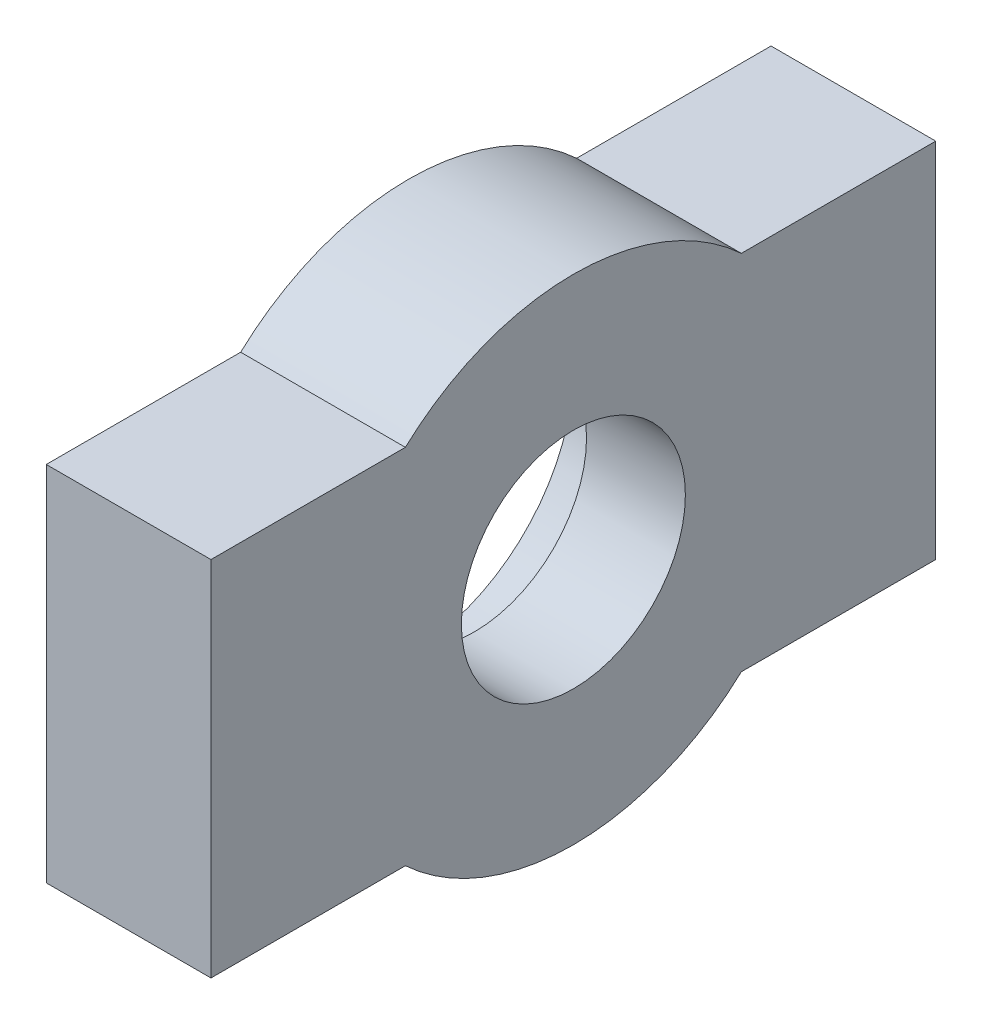
ISO-10303-21;
HEADER;
FILE_DESCRIPTION(('STEP AP214'),'2;1');
FILE_NAME('part.step','',(''),(''),'','','');
FILE_SCHEMA(('AUTOMOTIVE_DESIGN { 1 0 10303 214 1 1 1 1 }'));
ENDSEC;
DATA;
#1=APPLICATION_CONTEXT('core data for automotive mechanical design processes');
#2=APPLICATION_PROTOCOL_DEFINITION('international standard','automotive_design',2000,#1);
#3=PRODUCT_CONTEXT('',#1,'mechanical');
#4=PRODUCT('Part','Part','',(#3));
#5=PRODUCT_RELATED_PRODUCT_CATEGORY('part','',(#4));
#6=PRODUCT_DEFINITION_FORMATION('','',#4);
#7=PRODUCT_DEFINITION_CONTEXT('part definition',#1,'design');
#8=PRODUCT_DEFINITION('design','',#6,#7);
#9=PRODUCT_DEFINITION_SHAPE('','',#8);
#10=(LENGTH_UNIT() NAMED_UNIT(*) SI_UNIT(.MILLI.,.METRE.));
#11=(NAMED_UNIT(*) PLANE_ANGLE_UNIT() SI_UNIT($,.RADIAN.));
#12=(NAMED_UNIT(*) SI_UNIT($,.STERADIAN.) SOLID_ANGLE_UNIT());
#13=UNCERTAINTY_MEASURE_WITH_UNIT(LENGTH_MEASURE(1.E-05),#10,'distance_accuracy_value','');
#14=(GEOMETRIC_REPRESENTATION_CONTEXT(3) GLOBAL_UNCERTAINTY_ASSIGNED_CONTEXT((#13)) GLOBAL_UNIT_ASSIGNED_CONTEXT((#10,
#11,#12)) REPRESENTATION_CONTEXT('',''));
#15=CARTESIAN_POINT('',(0.,0.,0.));
#16=DIRECTION('',(0.,0.,1.));
#17=DIRECTION('',(1.,0.,0.));
#18=AXIS2_PLACEMENT_3D('',#15,#16,#17);
#19=CARTESIAN_POINT('',(5.,0.,0.));
#20=DIRECTION('',(-1.,0.,0.));
#21=DIRECTION('',(0.,0.,1.));
#22=AXIS2_PLACEMENT_3D('',#19,#20,#21);
#23=CYLINDRICAL_SURFACE('',#22,7.5);
#24=CARTESIAN_POINT('',(5.,0.,0.));
#25=DIRECTION('',(1.,0.,0.));
#26=DIRECTION('',(0.,0.,-1.));
#27=AXIS2_PLACEMENT_3D('',#24,#25,#26);
#28=CIRCLE('',#27,7.5);
#29=CARTESIAN_POINT('',(5.,5.5,-5.09901951359279));
#30=VERTEX_POINT('',#29);
#31=CARTESIAN_POINT('',(5.,5.5,5.09901951359279));
#32=VERTEX_POINT('',#31);
#33=EDGE_CURVE('E44',#30,#32,#28,.T.);
#34=ORIENTED_EDGE('',*,*,#33,.F.);
#35=DIRECTION('',(-1.,0.,0.));
#36=VECTOR('',#35,1.);
#37=CARTESIAN_POINT('',(5.,5.5,-5.09901951359279));
#38=LINE('',#37,#36);
#39=CARTESIAN_POINT('',(0.,5.5,-5.09901951359279));
#40=VERTEX_POINT('',#39);
#41=EDGE_CURVE('E134',#30,#40,#38,.T.);
#42=ORIENTED_EDGE('',*,*,#41,.T.);
#43=CARTESIAN_POINT('',(0.,0.,0.));
#44=DIRECTION('',(1.,0.,0.));
#45=DIRECTION('',(0.,0.,-1.));
#46=AXIS2_PLACEMENT_3D('',#43,#44,#45);
#47=CIRCLE('',#46,7.5);
#48=CARTESIAN_POINT('',(0.,5.5,5.09901951359279));
#49=VERTEX_POINT('',#48);
#50=EDGE_CURVE('E172',#40,#49,#47,.T.);
#51=ORIENTED_EDGE('',*,*,#50,.T.);
#52=DIRECTION('',(-1.,0.,0.));
#53=VECTOR('',#52,1.);
#54=CARTESIAN_POINT('',(5.,5.5,5.09901951359279));
#55=LINE('',#54,#53);
#56=EDGE_CURVE('E160',#49,#32,#55,.F.);
#57=ORIENTED_EDGE('',*,*,#56,.T.);
#58=EDGE_LOOP('',(#34,#42,#51,#57));
#59=FACE_BOUND('',#58,.T.);
#60=ADVANCED_FACE('F35',(#59),#23,.T.);
#61=CARTESIAN_POINT('',(0.,-5.5,5.09901951359279));
#62=VERTEX_POINT('',#61);
#63=CARTESIAN_POINT('',(0.,-5.5,-5.09901951359279));
#64=VERTEX_POINT('',#63);
#65=EDGE_CURVE('E39',#62,#64,#47,.T.);
#66=ORIENTED_EDGE('',*,*,#65,.T.);
#67=DIRECTION('',(-1.,0.,0.));
#68=VECTOR('',#67,1.);
#69=CARTESIAN_POINT('',(5.,-5.5,-5.09901951359279));
#70=LINE('',#69,#68);
#71=CARTESIAN_POINT('',(5.,-5.5,-5.09901951359279));
#72=VERTEX_POINT('',#71);
#73=EDGE_CURVE('E58',#64,#72,#70,.F.);
#74=ORIENTED_EDGE('',*,*,#73,.T.);
#75=CARTESIAN_POINT('',(5.,-5.5,5.09901951359279));
#76=VERTEX_POINT('',#75);
#77=EDGE_CURVE('E11',#76,#72,#28,.T.);
#78=ORIENTED_EDGE('',*,*,#77,.F.);
#79=DIRECTION('',(-1.,0.,0.));
#80=VECTOR('',#79,1.);
#81=CARTESIAN_POINT('',(5.,-5.5,5.09901951359279));
#82=LINE('',#81,#80);
#83=EDGE_CURVE('E155',#76,#62,#82,.T.);
#84=ORIENTED_EDGE('',*,*,#83,.T.);
#85=EDGE_LOOP('',(#66,#74,#78,#84));
#86=FACE_BOUND('',#85,.T.);
#87=ADVANCED_FACE('F37',(#86),#23,.T.);
#88=CARTESIAN_POINT('',(5.,0.,0.));
#89=DIRECTION('',(1.,0.,0.));
#90=DIRECTION('',(0.,0.,-1.));
#91=AXIS2_PLACEMENT_3D('',#88,#89,#90);
#92=PLANE('',#91);
#93=ORIENTED_EDGE('',*,*,#77,.T.);
#94=DIRECTION('',(0.,0.,1.));
#95=VECTOR('',#94,1.);
#96=CARTESIAN_POINT('',(5.,-5.5,-11.));
#97=LINE('',#96,#95);
#98=CARTESIAN_POINT('',(5.,-5.5,-11.));
#99=VERTEX_POINT('',#98);
#100=EDGE_CURVE('E103',#99,#72,#97,.T.);
#101=ORIENTED_EDGE('',*,*,#100,.F.);
#102=DIRECTION('',(0.,-1.,0.));
#103=VECTOR('',#102,1.);
#104=CARTESIAN_POINT('',(5.,5.5,-11.));
#105=LINE('',#104,#103);
#106=CARTESIAN_POINT('',(5.,5.5,-11.));
#107=VERTEX_POINT('',#106);
#108=EDGE_CURVE('E118',#107,#99,#105,.T.);
#109=ORIENTED_EDGE('',*,*,#108,.F.);
#110=DIRECTION('',(0.,0.,-1.));
#111=VECTOR('',#110,1.);
#112=CARTESIAN_POINT('',(5.,5.5,-11.));
#113=LINE('',#112,#111);
#114=EDGE_CURVE('E111',#30,#107,#113,.T.);
#115=ORIENTED_EDGE('',*,*,#114,.F.);
#116=ORIENTED_EDGE('',*,*,#33,.T.);
#117=DIRECTION('',(0.,0.,-1.));
#118=VECTOR('',#117,1.);
#119=CARTESIAN_POINT('',(5.,5.5,5.));
#120=LINE('',#119,#118);
#121=CARTESIAN_POINT('',(5.,5.5,11.));
#122=VERTEX_POINT('',#121);
#123=EDGE_CURVE('E143',#122,#32,#120,.T.);
#124=ORIENTED_EDGE('',*,*,#123,.F.);
#125=DIRECTION('',(0.,1.,0.));
#126=VECTOR('',#125,1.);
#127=CARTESIAN_POINT('',(5.,5.5,11.));
#128=LINE('',#127,#126);
#129=CARTESIAN_POINT('',(5.,-5.5,11.));
#130=VERTEX_POINT('',#129);
#131=EDGE_CURVE('E139',#130,#122,#128,.T.);
#132=ORIENTED_EDGE('',*,*,#131,.F.);
#133=DIRECTION('',(0.,0.,1.));
#134=VECTOR('',#133,1.);
#135=CARTESIAN_POINT('',(5.,-5.5,5.));
#136=LINE('',#135,#134);
#137=EDGE_CURVE('E137',#76,#130,#136,.T.);
#138=ORIENTED_EDGE('',*,*,#137,.F.);
#139=EDGE_LOOP('',(#93,#101,#109,#115,#116,#124,#132,#138));
#140=FACE_BOUND('',#139,.T.);
#141=CARTESIAN_POINT('',(5.,0.,0.));
#142=DIRECTION('',(-1.,0.,0.));
#143=DIRECTION('',(0.,0.,1.));
#144=AXIS2_PLACEMENT_3D('',#141,#142,#143);
#145=CIRCLE('',#144,3.4);
#146=CARTESIAN_POINT('',(5.,0.,3.4));
#147=VERTEX_POINT('',#146);
#148=EDGE_CURVE('E163',#147,#147,#145,.T.);
#149=ORIENTED_EDGE('',*,*,#148,.T.);
#150=EDGE_LOOP('',(#149));
#151=FACE_BOUND('',#150,.T.);
#152=ADVANCED_FACE('F115',(#140,#151),#92,.T.);
#153=CARTESIAN_POINT('',(0.,0.,0.));
#154=DIRECTION('',(1.,0.,0.));
#155=DIRECTION('',(0.,0.,-1.));
#156=AXIS2_PLACEMENT_3D('',#153,#154,#155);
#157=PLANE('',#156);
#158=CARTESIAN_POINT('',(0.,0.,0.));
#159=DIRECTION('',(-1.,0.,0.));
#160=DIRECTION('',(0.,0.,1.));
#161=AXIS2_PLACEMENT_3D('',#158,#159,#160);
#162=CIRCLE('',#161,5.);
#163=CARTESIAN_POINT('',(0.,0.,5.));
#164=VERTEX_POINT('',#163);
#165=EDGE_CURVE('E166',#164,#164,#162,.T.);
#166=ORIENTED_EDGE('',*,*,#165,.F.);
#167=EDGE_LOOP('',(#166));
#168=FACE_BOUND('',#167,.T.);
#169=ORIENTED_EDGE('',*,*,#50,.F.);
#170=DIRECTION('',(0.,0.,-1.));
#171=VECTOR('',#170,1.);
#172=CARTESIAN_POINT('',(0.,5.5,-11.));
#173=LINE('',#172,#171);
#174=CARTESIAN_POINT('',(0.,5.5,-11.));
#175=VERTEX_POINT('',#174);
#176=EDGE_CURVE('E124',#40,#175,#173,.T.);
#177=ORIENTED_EDGE('',*,*,#176,.T.);
#178=DIRECTION('',(0.,-1.,0.));
#179=VECTOR('',#178,1.);
#180=CARTESIAN_POINT('',(0.,5.5,-11.));
#181=LINE('',#180,#179);
#182=CARTESIAN_POINT('',(0.,-5.5,-11.));
#183=VERTEX_POINT('',#182);
#184=EDGE_CURVE('E129',#175,#183,#181,.T.);
#185=ORIENTED_EDGE('',*,*,#184,.T.);
#186=DIRECTION('',(0.,0.,1.));
#187=VECTOR('',#186,1.);
#188=CARTESIAN_POINT('',(0.,-5.5,-11.));
#189=LINE('',#188,#187);
#190=EDGE_CURVE('E105',#183,#64,#189,.T.);
#191=ORIENTED_EDGE('',*,*,#190,.T.);
#192=ORIENTED_EDGE('',*,*,#65,.F.);
#193=DIRECTION('',(0.,0.,1.));
#194=VECTOR('',#193,1.);
#195=CARTESIAN_POINT('',(0.,-5.5,5.));
#196=LINE('',#195,#194);
#197=CARTESIAN_POINT('',(0.,-5.5,11.));
#198=VERTEX_POINT('',#197);
#199=EDGE_CURVE('E136',#62,#198,#196,.T.);
#200=ORIENTED_EDGE('',*,*,#199,.T.);
#201=DIRECTION('',(0.,1.,0.));
#202=VECTOR('',#201,1.);
#203=CARTESIAN_POINT('',(0.,5.5,11.));
#204=LINE('',#203,#202);
#205=CARTESIAN_POINT('',(0.,5.5,11.));
#206=VERTEX_POINT('',#205);
#207=EDGE_CURVE('E148',#198,#206,#204,.T.);
#208=ORIENTED_EDGE('',*,*,#207,.T.);
#209=DIRECTION('',(0.,0.,-1.));
#210=VECTOR('',#209,1.);
#211=CARTESIAN_POINT('',(0.,5.5,5.));
#212=LINE('',#211,#210);
#213=EDGE_CURVE('E140',#206,#49,#212,.T.);
#214=ORIENTED_EDGE('',*,*,#213,.T.);
#215=EDGE_LOOP('',(#169,#177,#185,#191,#192,#200,#208,#214));
#216=FACE_BOUND('',#215,.T.);
#217=ADVANCED_FACE('F178',(#168,#216),#157,.F.);
#218=CARTESIAN_POINT('',(2.,0.,0.));
#219=DIRECTION('',(-1.,0.,0.));
#220=DIRECTION('',(0.,0.,1.));
#221=AXIS2_PLACEMENT_3D('',#218,#219,#220);
#222=CYLINDRICAL_SURFACE('',#221,5.);
#223=CARTESIAN_POINT('',(2.,0.,0.));
#224=DIRECTION('',(-1.,0.,0.));
#225=DIRECTION('',(0.,0.,1.));
#226=AXIS2_PLACEMENT_3D('',#223,#224,#225);
#227=CIRCLE('',#226,5.);
#228=CARTESIAN_POINT('',(2.,0.,5.));
#229=VERTEX_POINT('',#228);
#230=EDGE_CURVE('E169',#229,#229,#227,.T.);
#231=ORIENTED_EDGE('',*,*,#230,.F.);
#232=EDGE_LOOP('',(#231));
#233=FACE_BOUND('',#232,.T.);
#234=ORIENTED_EDGE('',*,*,#165,.T.);
#235=EDGE_LOOP('',(#234));
#236=FACE_BOUND('',#235,.T.);
#237=ADVANCED_FACE('F176',(#233,#236),#222,.F.);
#238=CARTESIAN_POINT('',(2.,0.,0.));
#239=DIRECTION('',(-1.,0.,0.));
#240=DIRECTION('',(0.,0.,1.));
#241=AXIS2_PLACEMENT_3D('',#238,#239,#240);
#242=PLANE('',#241);
#243=CARTESIAN_POINT('',(2.,0.,0.));
#244=DIRECTION('',(-1.,0.,0.));
#245=DIRECTION('',(0.,0.,1.));
#246=AXIS2_PLACEMENT_3D('',#243,#244,#245);
#247=CIRCLE('',#246,3.4);
#248=CARTESIAN_POINT('',(2.,0.,3.4));
#249=VERTEX_POINT('',#248);
#250=EDGE_CURVE('E162',#249,#249,#247,.T.);
#251=ORIENTED_EDGE('',*,*,#250,.F.);
#252=EDGE_LOOP('',(#251));
#253=FACE_BOUND('',#252,.T.);
#254=ORIENTED_EDGE('',*,*,#230,.T.);
#255=EDGE_LOOP('',(#254));
#256=FACE_BOUND('',#255,.T.);
#257=ADVANCED_FACE('F206',(#253,#256),#242,.T.);
#258=CARTESIAN_POINT('',(5.,0.,0.));
#259=DIRECTION('',(-1.,0.,0.));
#260=DIRECTION('',(0.,0.,1.));
#261=AXIS2_PLACEMENT_3D('',#258,#259,#260);
#262=CYLINDRICAL_SURFACE('',#261,3.4);
#263=ORIENTED_EDGE('',*,*,#148,.F.);
#264=EDGE_LOOP('',(#263));
#265=FACE_BOUND('',#264,.T.);
#266=ORIENTED_EDGE('',*,*,#250,.T.);
#267=EDGE_LOOP('',(#266));
#268=FACE_BOUND('',#267,.T.);
#269=ADVANCED_FACE('F199',(#265,#268),#262,.F.);
#270=CARTESIAN_POINT('',(5.,5.5,5.));
#271=DIRECTION('',(0.,1.,0.));
#272=DIRECTION('',(0.,0.,1.));
#273=AXIS2_PLACEMENT_3D('',#270,#271,#272);
#274=PLANE('',#273);
#275=ORIENTED_EDGE('',*,*,#56,.F.);
#276=ORIENTED_EDGE('',*,*,#213,.F.);
#277=DIRECTION('',(-1.,0.,0.));
#278=VECTOR('',#277,1.);
#279=CARTESIAN_POINT('',(5.,5.5,11.));
#280=LINE('',#279,#278);
#281=EDGE_CURVE('E153',#122,#206,#280,.T.);
#282=ORIENTED_EDGE('',*,*,#281,.F.);
#283=ORIENTED_EDGE('',*,*,#123,.T.);
#284=EDGE_LOOP('',(#275,#276,#282,#283));
#285=FACE_BOUND('',#284,.T.);
#286=ADVANCED_FACE('F196',(#285),#274,.T.);
#287=CARTESIAN_POINT('',(5.,-5.5,5.));
#288=DIRECTION('',(0.,-1.,0.));
#289=DIRECTION('',(0.,0.,-1.));
#290=AXIS2_PLACEMENT_3D('',#287,#288,#289);
#291=PLANE('',#290);
#292=ORIENTED_EDGE('',*,*,#83,.F.);
#293=ORIENTED_EDGE('',*,*,#137,.T.);
#294=DIRECTION('',(-1.,0.,0.));
#295=VECTOR('',#294,1.);
#296=CARTESIAN_POINT('',(5.,-5.5,11.));
#297=LINE('',#296,#295);
#298=EDGE_CURVE('E146',#130,#198,#297,.T.);
#299=ORIENTED_EDGE('',*,*,#298,.T.);
#300=ORIENTED_EDGE('',*,*,#199,.F.);
#301=EDGE_LOOP('',(#292,#293,#299,#300));
#302=FACE_BOUND('',#301,.T.);
#303=ADVANCED_FACE('F189',(#302),#291,.T.);
#304=CARTESIAN_POINT('',(5.,5.5,11.));
#305=DIRECTION('',(0.,0.,1.));
#306=DIRECTION('',(1.,0.,0.));
#307=AXIS2_PLACEMENT_3D('',#304,#305,#306);
#308=PLANE('',#307);
#309=ORIENTED_EDGE('',*,*,#207,.F.);
#310=ORIENTED_EDGE('',*,*,#298,.F.);
#311=ORIENTED_EDGE('',*,*,#131,.T.);
#312=ORIENTED_EDGE('',*,*,#281,.T.);
#313=EDGE_LOOP('',(#309,#310,#311,#312));
#314=FACE_BOUND('',#313,.T.);
#315=ADVANCED_FACE('F194',(#314),#308,.T.);
#316=CARTESIAN_POINT('',(5.,5.5,-11.));
#317=DIRECTION('',(0.,1.,0.));
#318=DIRECTION('',(0.,0.,1.));
#319=AXIS2_PLACEMENT_3D('',#316,#317,#318);
#320=PLANE('',#319);
#321=ORIENTED_EDGE('',*,*,#41,.F.);
#322=ORIENTED_EDGE('',*,*,#114,.T.);
#323=DIRECTION('',(-1.,0.,0.));
#324=VECTOR('',#323,1.);
#325=CARTESIAN_POINT('',(5.,5.5,-11.));
#326=LINE('',#325,#324);
#327=EDGE_CURVE('E110',#107,#175,#326,.T.);
#328=ORIENTED_EDGE('',*,*,#327,.T.);
#329=ORIENTED_EDGE('',*,*,#176,.F.);
#330=EDGE_LOOP('',(#321,#322,#328,#329));
#331=FACE_BOUND('',#330,.T.);
#332=ADVANCED_FACE('F185',(#331),#320,.T.);
#333=CARTESIAN_POINT('',(5.,-5.5,-11.));
#334=DIRECTION('',(0.,-1.,0.));
#335=DIRECTION('',(0.,0.,-1.));
#336=AXIS2_PLACEMENT_3D('',#333,#334,#335);
#337=PLANE('',#336);
#338=ORIENTED_EDGE('',*,*,#73,.F.);
#339=ORIENTED_EDGE('',*,*,#190,.F.);
#340=DIRECTION('',(-1.,0.,0.));
#341=VECTOR('',#340,1.);
#342=CARTESIAN_POINT('',(5.,-5.5,-11.));
#343=LINE('',#342,#341);
#344=EDGE_CURVE('E100',#99,#183,#343,.T.);
#345=ORIENTED_EDGE('',*,*,#344,.F.);
#346=ORIENTED_EDGE('',*,*,#100,.T.);
#347=EDGE_LOOP('',(#338,#339,#345,#346));
#348=FACE_BOUND('',#347,.T.);
#349=ADVANCED_FACE('F102',(#348),#337,.T.);
#350=CARTESIAN_POINT('',(5.,5.5,-11.));
#351=DIRECTION('',(0.,0.,-1.));
#352=DIRECTION('',(-1.,0.,0.));
#353=AXIS2_PLACEMENT_3D('',#350,#351,#352);
#354=PLANE('',#353);
#355=ORIENTED_EDGE('',*,*,#184,.F.);
#356=ORIENTED_EDGE('',*,*,#327,.F.);
#357=ORIENTED_EDGE('',*,*,#108,.T.);
#358=ORIENTED_EDGE('',*,*,#344,.T.);
#359=EDGE_LOOP('',(#355,#356,#357,#358));
#360=FACE_BOUND('',#359,.T.);
#361=ADVANCED_FACE('F122',(#360),#354,.T.);
#362=CLOSED_SHELL('',(#60,#87,#152,#217,#237,#257,#269,#286,#303,#315,#332,#349,#361));
#363=MANIFOLD_SOLID_BREP('B2',#362);
#364=ADVANCED_BREP_SHAPE_REPRESENTATION('',(#18,#363),#14);
#365=SHAPE_DEFINITION_REPRESENTATION(#9,#364);
ENDSEC;
END-ISO-10303-21;
